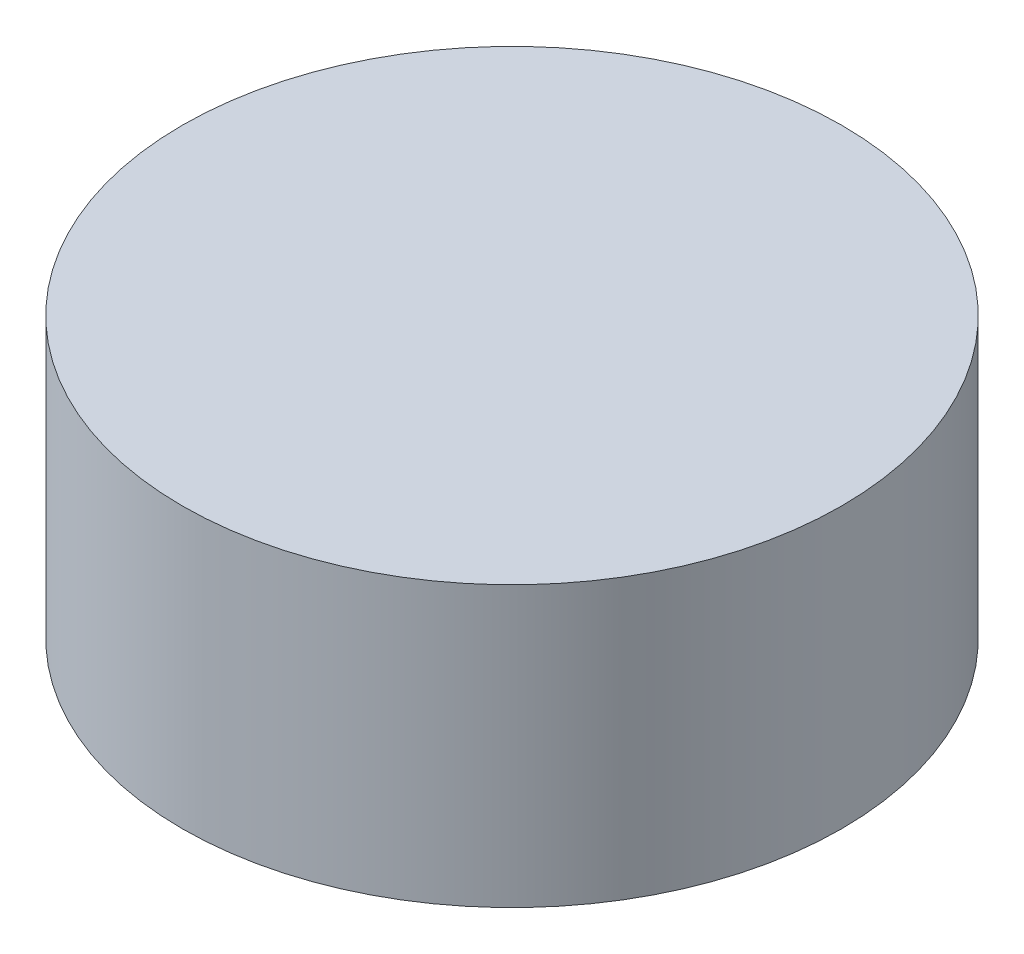
ISO-10303-21;
HEADER;
FILE_DESCRIPTION(('STEP AP214'),'2;1');
FILE_NAME('part.step','',(''),(''),'','','');
FILE_SCHEMA(('AUTOMOTIVE_DESIGN { 1 0 10303 214 1 1 1 1 }'));
ENDSEC;
DATA;
#1=APPLICATION_CONTEXT('core data for automotive mechanical design processes');
#2=APPLICATION_PROTOCOL_DEFINITION('international standard','automotive_design',2000,#1);
#3=PRODUCT_CONTEXT('',#1,'mechanical');
#4=PRODUCT('Part','Part','',(#3));
#5=PRODUCT_RELATED_PRODUCT_CATEGORY('part','',(#4));
#6=PRODUCT_DEFINITION_FORMATION('','',#4);
#7=PRODUCT_DEFINITION_CONTEXT('part definition',#1,'design');
#8=PRODUCT_DEFINITION('design','',#6,#7);
#9=PRODUCT_DEFINITION_SHAPE('','',#8);
#10=(LENGTH_UNIT() NAMED_UNIT(*) SI_UNIT(.MILLI.,.METRE.));
#11=(NAMED_UNIT(*) PLANE_ANGLE_UNIT() SI_UNIT($,.RADIAN.));
#12=(NAMED_UNIT(*) SI_UNIT($,.STERADIAN.) SOLID_ANGLE_UNIT());
#13=UNCERTAINTY_MEASURE_WITH_UNIT(LENGTH_MEASURE(1.E-05),#10,'distance_accuracy_value','');
#14=(GEOMETRIC_REPRESENTATION_CONTEXT(3) GLOBAL_UNCERTAINTY_ASSIGNED_CONTEXT((#13)) GLOBAL_UNIT_ASSIGNED_CONTEXT((#10,
#11,#12)) REPRESENTATION_CONTEXT('',''));
#15=CARTESIAN_POINT('',(0.,0.,0.));
#16=DIRECTION('',(0.,0.,1.));
#17=DIRECTION('',(1.,0.,0.));
#18=AXIS2_PLACEMENT_3D('',#15,#16,#17);
#19=CARTESIAN_POINT('',(0.,252.019037432019,562.5));
#20=DIRECTION('',(0.,1.,0.));
#21=DIRECTION('',(0.,0.,1.));
#22=AXIS2_PLACEMENT_3D('',#19,#20,#21);
#23=PLANE('',#22);
#24=CARTESIAN_POINT('',(0.,252.019037432019,0.));
#25=DIRECTION('',(0.,1.,0.));
#26=DIRECTION('',(0.,0.,1.));
#27=AXIS2_PLACEMENT_3D('',#24,#25,#26);
#28=CIRCLE('',#27,562.5);
#29=CARTESIAN_POINT('',(0.,252.019037432019,562.5));
#30=VERTEX_POINT('',#29);
#31=EDGE_CURVE('E85',#30,#30,#28,.T.);
#32=ORIENTED_EDGE('',*,*,#31,.T.);
#33=EDGE_LOOP('',(#32));
#34=FACE_BOUND('',#33,.T.);
#35=ADVANCED_FACE('F40',(#34),#23,.T.);
#36=CARTESIAN_POINT('',(0.,-225.,562.5));
#37=DIRECTION('',(0.,-1.,0.));
#38=DIRECTION('',(0.,0.,-1.));
#39=AXIS2_PLACEMENT_3D('',#36,#37,#38);
#40=PLANE('',#39);
#41=CARTESIAN_POINT('',(0.,-225.,0.));
#42=DIRECTION('',(0.,1.,0.));
#43=DIRECTION('',(0.,0.,1.));
#44=AXIS2_PLACEMENT_3D('',#41,#42,#43);
#45=CIRCLE('',#44,562.5);
#46=CARTESIAN_POINT('',(0.,-225.,562.5));
#47=VERTEX_POINT('',#46);
#48=EDGE_CURVE('E81',#47,#47,#45,.T.);
#49=ORIENTED_EDGE('',*,*,#48,.F.);
#50=EDGE_LOOP('',(#49));
#51=FACE_BOUND('',#50,.T.);
#52=ADVANCED_FACE('F93',(#51),#40,.T.);
#53=CARTESIAN_POINT('',(0.,225.,0.));
#54=DIRECTION('',(0.,1.,0.));
#55=DIRECTION('',(0.,0.,1.));
#56=AXIS2_PLACEMENT_3D('',#53,#54,#55);
#57=CYLINDRICAL_SURFACE('',#56,562.5);
#58=ORIENTED_EDGE('',*,*,#48,.T.);
#59=EDGE_LOOP('',(#58));
#60=FACE_BOUND('',#59,.T.);
#61=ORIENTED_EDGE('',*,*,#31,.F.);
#62=EDGE_LOOP('',(#61));
#63=FACE_BOUND('',#62,.T.);
#64=ADVANCED_FACE('F91',(#60,#63),#57,.T.);
#65=CLOSED_SHELL('',(#35,#52,#64));
#66=CARTESIAN_POINT('',(0.,-190.,275.));
#67=DIRECTION('',(0.,-1.,0.));
#68=DIRECTION('',(0.,0.,-1.));
#69=AXIS2_PLACEMENT_3D('',#66,#67,#68);
#70=PLANE('',#69);
#71=CARTESIAN_POINT('',(0.,-190.,0.));
#72=DIRECTION('',(0.,1.,0.));
#73=DIRECTION('',(0.,0.,1.));
#74=AXIS2_PLACEMENT_3D('',#71,#72,#73);
#75=CIRCLE('',#74,275.);
#76=CARTESIAN_POINT('',(0.,-190.,275.));
#77=VERTEX_POINT('',#76);
#78=EDGE_CURVE('E10',#77,#77,#75,.T.);
#79=ORIENTED_EDGE('',*,*,#78,.F.);
#80=EDGE_LOOP('',(#79));
#81=FACE_BOUND('',#80,.T.);
#82=CARTESIAN_POINT('',(0.,-190.,0.));
#83=DIRECTION('',(0.,1.,0.));
#84=DIRECTION('',(0.,0.,1.));
#85=AXIS2_PLACEMENT_3D('',#82,#83,#84);
#86=CIRCLE('',#85,537.5);
#87=CARTESIAN_POINT('',(0.,-190.,537.5));
#88=VERTEX_POINT('',#87);
#89=EDGE_CURVE('E77',#88,#88,#86,.T.);
#90=ORIENTED_EDGE('',*,*,#89,.T.);
#91=EDGE_LOOP('',(#90));
#92=FACE_BOUND('',#91,.T.);
#93=ADVANCED_FACE('F42',(#81,#92),#70,.F.);
#94=CARTESIAN_POINT('',(0.,225.,0.));
#95=DIRECTION('',(0.,1.,0.));
#96=DIRECTION('',(0.,0.,1.));
#97=AXIS2_PLACEMENT_3D('',#94,#95,#96);
#98=CYLINDRICAL_SURFACE('',#97,275.);
#99=CARTESIAN_POINT('',(0.,-215.,0.));
#100=DIRECTION('',(0.,1.,0.));
#101=DIRECTION('',(0.,0.,1.));
#102=AXIS2_PLACEMENT_3D('',#99,#100,#101);
#103=CIRCLE('',#102,275.);
#104=CARTESIAN_POINT('',(0.,-215.,275.));
#105=VERTEX_POINT('',#104);
#106=EDGE_CURVE('E49',#105,#105,#103,.T.);
#107=ORIENTED_EDGE('',*,*,#106,.F.);
#108=EDGE_LOOP('',(#107));
#109=FACE_BOUND('',#108,.T.);
#110=ORIENTED_EDGE('',*,*,#78,.T.);
#111=EDGE_LOOP('',(#110));
#112=FACE_BOUND('',#111,.T.);
#113=ADVANCED_FACE('F130',(#109,#112),#98,.F.);
#114=CARTESIAN_POINT('',(0.,-215.,275.));
#115=DIRECTION('',(0.,-1.,0.));
#116=DIRECTION('',(0.,0.,-1.));
#117=AXIS2_PLACEMENT_3D('',#114,#115,#116);
#118=PLANE('',#117);
#119=CARTESIAN_POINT('',(0.,-215.,0.));
#120=DIRECTION('',(0.,1.,0.));
#121=DIRECTION('',(0.,0.,1.));
#122=AXIS2_PLACEMENT_3D('',#119,#120,#121);
#123=CIRCLE('',#122,220.);
#124=CARTESIAN_POINT('',(0.,-215.,220.));
#125=VERTEX_POINT('',#124);
#126=EDGE_CURVE('E54',#125,#125,#123,.T.);
#127=ORIENTED_EDGE('',*,*,#126,.F.);
#128=EDGE_LOOP('',(#127));
#129=FACE_BOUND('',#128,.T.);
#130=ORIENTED_EDGE('',*,*,#106,.T.);
#131=EDGE_LOOP('',(#130));
#132=FACE_BOUND('',#131,.T.);
#133=ADVANCED_FACE('F127',(#129,#132),#118,.F.);
#134=CARTESIAN_POINT('',(0.,225.,0.));
#135=DIRECTION('',(0.,1.,0.));
#136=DIRECTION('',(0.,0.,1.));
#137=AXIS2_PLACEMENT_3D('',#134,#135,#136);
#138=CYLINDRICAL_SURFACE('',#137,220.);
#139=CARTESIAN_POINT('',(0.,-190.,0.));
#140=DIRECTION('',(0.,1.,0.));
#141=DIRECTION('',(0.,0.,1.));
#142=AXIS2_PLACEMENT_3D('',#139,#140,#141);
#143=CIRCLE('',#142,220.);
#144=CARTESIAN_POINT('',(0.,-190.,220.));
#145=VERTEX_POINT('',#144);
#146=EDGE_CURVE('E59',#145,#145,#143,.T.);
#147=ORIENTED_EDGE('',*,*,#146,.F.);
#148=EDGE_LOOP('',(#147));
#149=FACE_BOUND('',#148,.T.);
#150=ORIENTED_EDGE('',*,*,#126,.T.);
#151=EDGE_LOOP('',(#150));
#152=FACE_BOUND('',#151,.T.);
#153=ADVANCED_FACE('F123',(#149,#152),#138,.T.);
#154=CARTESIAN_POINT('',(0.,-190.,29.9999999999999));
#155=DIRECTION('',(0.,-1.,0.));
#156=DIRECTION('',(0.,0.,-1.));
#157=AXIS2_PLACEMENT_3D('',#154,#155,#156);
#158=PLANE('',#157);
#159=CARTESIAN_POINT('',(0.,-190.,0.));
#160=DIRECTION('',(0.,1.,0.));
#161=DIRECTION('',(0.,0.,1.));
#162=AXIS2_PLACEMENT_3D('',#159,#160,#161);
#163=CIRCLE('',#162,29.9999999999999);
#164=CARTESIAN_POINT('',(0.,-190.,29.9999999999999));
#165=VERTEX_POINT('',#164);
#166=EDGE_CURVE('E65',#165,#165,#163,.T.);
#167=ORIENTED_EDGE('',*,*,#166,.F.);
#168=EDGE_LOOP('',(#167));
#169=FACE_BOUND('',#168,.T.);
#170=ORIENTED_EDGE('',*,*,#146,.T.);
#171=EDGE_LOOP('',(#170));
#172=FACE_BOUND('',#171,.T.);
#173=ADVANCED_FACE('F119',(#169,#172),#158,.F.);
#174=CARTESIAN_POINT('',(0.,225.,0.));
#175=DIRECTION('',(0.,1.,0.));
#176=DIRECTION('',(0.,0.,1.));
#177=AXIS2_PLACEMENT_3D('',#174,#175,#176);
#178=CYLINDRICAL_SURFACE('',#177,29.9999999999999);
#179=CARTESIAN_POINT('',(0.,225.,0.));
#180=DIRECTION('',(0.,1.,0.));
#181=DIRECTION('',(0.,0.,1.));
#182=AXIS2_PLACEMENT_3D('',#179,#180,#181);
#183=CIRCLE('',#182,29.9999999999999);
#184=CARTESIAN_POINT('',(0.,225.,29.9999999999999));
#185=VERTEX_POINT('',#184);
#186=EDGE_CURVE('E69',#185,#185,#183,.T.);
#187=ORIENTED_EDGE('',*,*,#186,.F.);
#188=EDGE_LOOP('',(#187));
#189=FACE_BOUND('',#188,.T.);
#190=ORIENTED_EDGE('',*,*,#166,.T.);
#191=EDGE_LOOP('',(#190));
#192=FACE_BOUND('',#191,.T.);
#193=ADVANCED_FACE('F115',(#189,#192),#178,.T.);
#194=CARTESIAN_POINT('',(0.,225.,537.5));
#195=DIRECTION('',(0.,1.,0.));
#196=DIRECTION('',(0.,0.,1.));
#197=AXIS2_PLACEMENT_3D('',#194,#195,#196);
#198=PLANE('',#197);
#199=CARTESIAN_POINT('',(0.,225.,0.));
#200=DIRECTION('',(0.,1.,0.));
#201=DIRECTION('',(0.,0.,1.));
#202=AXIS2_PLACEMENT_3D('',#199,#200,#201);
#203=CIRCLE('',#202,537.5);
#204=CARTESIAN_POINT('',(0.,225.,537.5));
#205=VERTEX_POINT('',#204);
#206=EDGE_CURVE('E73',#205,#205,#203,.T.);
#207=ORIENTED_EDGE('',*,*,#206,.F.);
#208=EDGE_LOOP('',(#207));
#209=FACE_BOUND('',#208,.T.);
#210=ORIENTED_EDGE('',*,*,#186,.T.);
#211=EDGE_LOOP('',(#210));
#212=FACE_BOUND('',#211,.T.);
#213=ADVANCED_FACE('F110',(#209,#212),#198,.F.);
#214=CARTESIAN_POINT('',(0.,225.,0.));
#215=DIRECTION('',(0.,1.,0.));
#216=DIRECTION('',(0.,0.,1.));
#217=AXIS2_PLACEMENT_3D('',#214,#215,#216);
#218=CYLINDRICAL_SURFACE('',#217,537.5);
#219=ORIENTED_EDGE('',*,*,#89,.F.);
#220=EDGE_LOOP('',(#219));
#221=FACE_BOUND('',#220,.T.);
#222=ORIENTED_EDGE('',*,*,#206,.T.);
#223=EDGE_LOOP('',(#222));
#224=FACE_BOUND('',#223,.T.);
#225=ADVANCED_FACE('F107',(#221,#224),#218,.F.);
#226=CLOSED_SHELL('',(#93,#113,#133,#153,#173,#193,#213,#225));
#227=ORIENTED_CLOSED_SHELL('',*,#226,.T.);
#228=BREP_WITH_VOIDS('B2',#65,(#227));
#229=ADVANCED_BREP_SHAPE_REPRESENTATION('',(#18,#228),#14);
#230=SHAPE_DEFINITION_REPRESENTATION(#9,#229);
ENDSEC;
END-ISO-10303-21;
